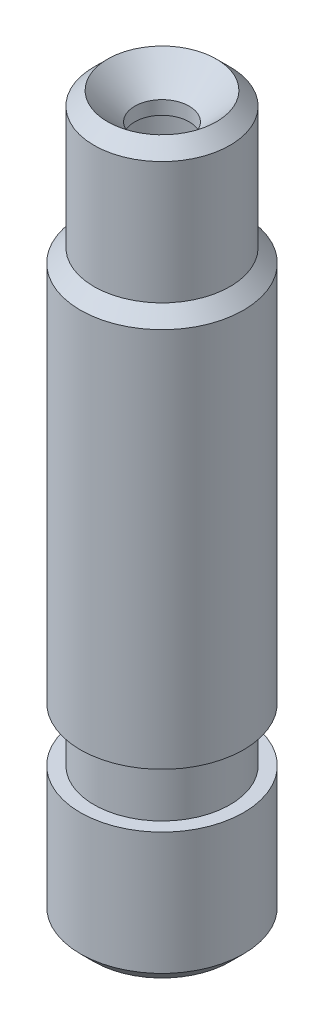
ISO-10303-21;
HEADER;
FILE_DESCRIPTION(('STEP AP214'),'2;1');
FILE_NAME('part.step','',(''),(''),'','','');
FILE_SCHEMA(('AUTOMOTIVE_DESIGN { 1 0 10303 214 1 1 1 1 }'));
ENDSEC;
DATA;
#1=APPLICATION_CONTEXT('core data for automotive mechanical design processes');
#2=APPLICATION_PROTOCOL_DEFINITION('international standard','automotive_design',2000,#1);
#3=PRODUCT_CONTEXT('',#1,'mechanical');
#4=PRODUCT('Part','Part','',(#3));
#5=PRODUCT_RELATED_PRODUCT_CATEGORY('part','',(#4));
#6=PRODUCT_DEFINITION_FORMATION('','',#4);
#7=PRODUCT_DEFINITION_CONTEXT('part definition',#1,'design');
#8=PRODUCT_DEFINITION('design','',#6,#7);
#9=PRODUCT_DEFINITION_SHAPE('','',#8);
#10=(LENGTH_UNIT() NAMED_UNIT(*) SI_UNIT(.MILLI.,.METRE.));
#11=(NAMED_UNIT(*) PLANE_ANGLE_UNIT() SI_UNIT($,.RADIAN.));
#12=(NAMED_UNIT(*) SI_UNIT($,.STERADIAN.) SOLID_ANGLE_UNIT());
#13=UNCERTAINTY_MEASURE_WITH_UNIT(LENGTH_MEASURE(1.E-05),#10,'distance_accuracy_value','');
#14=(GEOMETRIC_REPRESENTATION_CONTEXT(3) GLOBAL_UNCERTAINTY_ASSIGNED_CONTEXT((#13)) GLOBAL_UNIT_ASSIGNED_CONTEXT((#10,
#11,#12)) REPRESENTATION_CONTEXT('',''));
#15=CARTESIAN_POINT('',(0.,0.,0.));
#16=DIRECTION('',(0.,0.,1.));
#17=DIRECTION('',(1.,0.,0.));
#18=AXIS2_PLACEMENT_3D('',#15,#16,#17);
#19=CARTESIAN_POINT('',(0.,26.5,0.));
#20=DIRECTION('',(0.,-1.,0.));
#21=DIRECTION('',(0.,0.,-1.));
#22=AXIS2_PLACEMENT_3D('',#19,#20,#21);
#23=CYLINDRICAL_SURFACE('',#22,3.);
#24=CARTESIAN_POINT('',(0.,21.,0.));
#25=DIRECTION('',(0.,1.,0.));
#26=DIRECTION('',(0.,0.,1.));
#27=AXIS2_PLACEMENT_3D('',#24,#25,#26);
#28=CIRCLE('',#27,3.);
#29=CARTESIAN_POINT('',(0.,21.,3.));
#30=VERTEX_POINT('',#29);
#31=EDGE_CURVE('E38',#30,#30,#28,.F.);
#32=ORIENTED_EDGE('',*,*,#31,.T.);
#33=EDGE_LOOP('',(#32));
#34=FACE_BOUND('',#33,.T.);
#35=CARTESIAN_POINT('',(0.,7.,0.));
#36=DIRECTION('',(0.,-1.,0.));
#37=DIRECTION('',(0.,0.,-1.));
#38=AXIS2_PLACEMENT_3D('',#35,#36,#37);
#39=CIRCLE('',#38,3.);
#40=CARTESIAN_POINT('',(0.,7.,-3.));
#41=VERTEX_POINT('',#40);
#42=EDGE_CURVE('E41',#41,#41,#39,.T.);
#43=ORIENTED_EDGE('',*,*,#42,.F.);
#44=EDGE_LOOP('',(#43));
#45=FACE_BOUND('',#44,.T.);
#46=ADVANCED_FACE('F15',(#34,#45),#23,.T.);
#47=CARTESIAN_POINT('',(0.,26.5,0.));
#48=DIRECTION('',(0.,-1.,0.));
#49=DIRECTION('',(0.,0.,-1.));
#50=AXIS2_PLACEMENT_3D('',#47,#48,#49);
#51=CYLINDRICAL_SURFACE('',#50,1.);
#52=CARTESIAN_POINT('',(0.,25.5,0.));
#53=DIRECTION('',(0.,1.,0.));
#54=DIRECTION('',(0.,0.,1.));
#55=AXIS2_PLACEMENT_3D('',#52,#53,#54);
#56=CIRCLE('',#55,1.);
#57=CARTESIAN_POINT('',(0.,25.5,1.));
#58=VERTEX_POINT('',#57);
#59=EDGE_CURVE('E10',#58,#58,#56,.T.);
#60=ORIENTED_EDGE('',*,*,#59,.T.);
#61=EDGE_LOOP('',(#60));
#62=FACE_BOUND('',#61,.T.);
#63=CARTESIAN_POINT('',(0.,25.,0.));
#64=DIRECTION('',(0.,-1.,0.));
#65=DIRECTION('',(0.,0.,-1.));
#66=AXIS2_PLACEMENT_3D('',#63,#64,#65);
#67=CIRCLE('',#66,1.);
#68=CARTESIAN_POINT('',(0.,25.,-1.));
#69=VERTEX_POINT('',#68);
#70=EDGE_CURVE('E42',#69,#69,#67,.T.);
#71=ORIENTED_EDGE('',*,*,#70,.T.);
#72=EDGE_LOOP('',(#71));
#73=FACE_BOUND('',#72,.T.);
#74=ADVANCED_FACE('F88',(#62,#73),#51,.F.);
#75=CARTESIAN_POINT('',(0.,0.,0.));
#76=DIRECTION('',(0.,1.,0.));
#77=DIRECTION('',(0.,0.,1.));
#78=AXIS2_PLACEMENT_3D('',#75,#76,#77);
#79=PLANE('',#78);
#80=CARTESIAN_POINT('',(0.,0.,0.));
#81=DIRECTION('',(0.,1.,0.));
#82=DIRECTION('',(0.,0.,1.));
#83=AXIS2_PLACEMENT_3D('',#80,#81,#82);
#84=CIRCLE('',#83,2.5);
#85=CARTESIAN_POINT('',(0.,0.,2.5));
#86=VERTEX_POINT('',#85);
#87=EDGE_CURVE('E22',#86,#86,#84,.F.);
#88=ORIENTED_EDGE('',*,*,#87,.T.);
#89=EDGE_LOOP('',(#88));
#90=FACE_BOUND('',#89,.T.);
#91=CARTESIAN_POINT('',(0.,0.,0.));
#92=DIRECTION('',(0.,-1.,0.));
#93=DIRECTION('',(0.,0.,-1.));
#94=AXIS2_PLACEMENT_3D('',#91,#92,#93);
#95=CIRCLE('',#94,2.05);
#96=CARTESIAN_POINT('',(0.,0.,-2.05));
#97=VERTEX_POINT('',#96);
#98=EDGE_CURVE('E57',#97,#97,#95,.T.);
#99=ORIENTED_EDGE('',*,*,#98,.F.);
#100=EDGE_LOOP('',(#99));
#101=FACE_BOUND('',#100,.T.);
#102=ADVANCED_FACE('F95',(#90,#101),#79,.F.);
#103=CARTESIAN_POINT('',(0.,0.500000000000007,0.));
#104=DIRECTION('',(0.,1.,0.));
#105=DIRECTION('',(0.,0.,1.));
#106=AXIS2_PLACEMENT_3D('',#103,#104,#105);
#107=CIRCLE('',#106,3.);
#108=CARTESIAN_POINT('',(0.,0.500000000000007,3.));
#109=VERTEX_POINT('',#108);
#110=EDGE_CURVE('E26',#109,#109,#107,.T.);
#111=ORIENTED_EDGE('',*,*,#110,.T.);
#112=EDGE_LOOP('',(#111));
#113=FACE_BOUND('',#112,.T.);
#114=CARTESIAN_POINT('',(0.,5.,0.));
#115=DIRECTION('',(0.,-1.,0.));
#116=DIRECTION('',(0.,0.,-1.));
#117=AXIS2_PLACEMENT_3D('',#114,#115,#116);
#118=CIRCLE('',#117,3.);
#119=CARTESIAN_POINT('',(0.,5.,-3.));
#120=VERTEX_POINT('',#119);
#121=EDGE_CURVE('E49',#120,#120,#118,.T.);
#122=ORIENTED_EDGE('',*,*,#121,.T.);
#123=EDGE_LOOP('',(#122));
#124=FACE_BOUND('',#123,.T.);
#125=ADVANCED_FACE('F90',(#113,#124),#23,.T.);
#126=CARTESIAN_POINT('',(0.,7.,0.));
#127=DIRECTION('',(0.,-1.,0.));
#128=DIRECTION('',(0.,0.,-1.));
#129=AXIS2_PLACEMENT_3D('',#126,#127,#128);
#130=PLANE('',#129);
#131=CARTESIAN_POINT('',(0.,7.,0.));
#132=DIRECTION('',(0.,-1.,0.));
#133=DIRECTION('',(0.,0.,-1.));
#134=AXIS2_PLACEMENT_3D('',#131,#132,#133);
#135=CIRCLE('',#134,2.5);
#136=CARTESIAN_POINT('',(0.,7.,-2.5));
#137=VERTEX_POINT('',#136);
#138=EDGE_CURVE('E52',#137,#137,#135,.T.);
#139=ORIENTED_EDGE('',*,*,#138,.F.);
#140=EDGE_LOOP('',(#139));
#141=FACE_BOUND('',#140,.T.);
#142=ORIENTED_EDGE('',*,*,#42,.T.);
#143=EDGE_LOOP('',(#142));
#144=FACE_BOUND('',#143,.T.);
#145=ADVANCED_FACE('F100',(#141,#144),#130,.T.);
#146=CARTESIAN_POINT('',(0.,5.,0.));
#147=DIRECTION('',(0.,-1.,0.));
#148=DIRECTION('',(0.,0.,-1.));
#149=AXIS2_PLACEMENT_3D('',#146,#147,#148);
#150=PLANE('',#149);
#151=CARTESIAN_POINT('',(0.,5.,0.));
#152=DIRECTION('',(0.,-1.,0.));
#153=DIRECTION('',(0.,0.,-1.));
#154=AXIS2_PLACEMENT_3D('',#151,#152,#153);
#155=CIRCLE('',#154,2.5);
#156=CARTESIAN_POINT('',(0.,5.,-2.5));
#157=VERTEX_POINT('',#156);
#158=EDGE_CURVE('E45',#157,#157,#155,.T.);
#159=ORIENTED_EDGE('',*,*,#158,.T.);
#160=EDGE_LOOP('',(#159));
#161=FACE_BOUND('',#160,.T.);
#162=ORIENTED_EDGE('',*,*,#121,.F.);
#163=EDGE_LOOP('',(#162));
#164=FACE_BOUND('',#163,.T.);
#165=ADVANCED_FACE('F107',(#161,#164),#150,.F.);
#166=CARTESIAN_POINT('',(0.,7.,0.));
#167=DIRECTION('',(0.,-1.,0.));
#168=DIRECTION('',(0.,0.,-1.));
#169=AXIS2_PLACEMENT_3D('',#166,#167,#168);
#170=CYLINDRICAL_SURFACE('',#169,2.5);
#171=ORIENTED_EDGE('',*,*,#138,.T.);
#172=EDGE_LOOP('',(#171));
#173=FACE_BOUND('',#172,.T.);
#174=ORIENTED_EDGE('',*,*,#158,.F.);
#175=EDGE_LOOP('',(#174));
#176=FACE_BOUND('',#175,.T.);
#177=ADVANCED_FACE('F115',(#173,#176),#170,.T.);
#178=CARTESIAN_POINT('',(0.,25.,0.));
#179=DIRECTION('',(0.,-1.,0.));
#180=DIRECTION('',(0.,0.,-1.));
#181=AXIS2_PLACEMENT_3D('',#178,#179,#180);
#182=CYLINDRICAL_SURFACE('',#181,2.05);
#183=CARTESIAN_POINT('',(0.,25.,0.));
#184=DIRECTION('',(0.,-1.,0.));
#185=DIRECTION('',(0.,0.,-1.));
#186=AXIS2_PLACEMENT_3D('',#183,#184,#185);
#187=CIRCLE('',#186,2.05);
#188=CARTESIAN_POINT('',(0.,25.,-2.05));
#189=VERTEX_POINT('',#188);
#190=EDGE_CURVE('E46',#189,#189,#187,.T.);
#191=ORIENTED_EDGE('',*,*,#190,.F.);
#192=EDGE_LOOP('',(#191));
#193=FACE_BOUND('',#192,.T.);
#194=ORIENTED_EDGE('',*,*,#98,.T.);
#195=EDGE_LOOP('',(#194));
#196=FACE_BOUND('',#195,.T.);
#197=ADVANCED_FACE('F122',(#193,#196),#182,.F.);
#198=CARTESIAN_POINT('',(0.,25.,0.));
#199=DIRECTION('',(0.,-1.,0.));
#200=DIRECTION('',(0.,0.,-1.));
#201=AXIS2_PLACEMENT_3D('',#198,#199,#200);
#202=PLANE('',#201);
#203=ORIENTED_EDGE('',*,*,#70,.F.);
#204=EDGE_LOOP('',(#203));
#205=FACE_BOUND('',#204,.T.);
#206=ORIENTED_EDGE('',*,*,#190,.T.);
#207=EDGE_LOOP('',(#206));
#208=FACE_BOUND('',#207,.T.);
#209=ADVANCED_FACE('F82',(#205,#208),#202,.T.);
#210=CARTESIAN_POINT('',(0.,21.5,0.));
#211=DIRECTION('',(0.,1.,0.));
#212=DIRECTION('',(0.,0.,1.));
#213=AXIS2_PLACEMENT_3D('',#210,#211,#212);
#214=CYLINDRICAL_SURFACE('',#213,2.5);
#215=CARTESIAN_POINT('',(0.,26.,0.));
#216=DIRECTION('',(0.,1.,0.));
#217=DIRECTION('',(0.,0.,1.));
#218=AXIS2_PLACEMENT_3D('',#215,#216,#217);
#219=CIRCLE('',#218,2.5);
#220=CARTESIAN_POINT('',(0.,26.,2.5));
#221=VERTEX_POINT('',#220);
#222=EDGE_CURVE('E30',#221,#221,#219,.F.);
#223=ORIENTED_EDGE('',*,*,#222,.T.);
#224=EDGE_LOOP('',(#223));
#225=FACE_BOUND('',#224,.T.);
#226=CARTESIAN_POINT('',(0.,21.5,0.));
#227=DIRECTION('',(0.,1.,0.));
#228=DIRECTION('',(0.,0.,1.));
#229=AXIS2_PLACEMENT_3D('',#226,#227,#228);
#230=CIRCLE('',#229,2.5);
#231=CARTESIAN_POINT('',(0.,21.5,2.5));
#232=VERTEX_POINT('',#231);
#233=EDGE_CURVE('E60',#232,#232,#230,.T.);
#234=ORIENTED_EDGE('',*,*,#233,.T.);
#235=EDGE_LOOP('',(#234));
#236=FACE_BOUND('',#235,.T.);
#237=ADVANCED_FACE('F66',(#225,#236),#214,.T.);
#238=CARTESIAN_POINT('',(0.,21.5,0.));
#239=DIRECTION('',(0.,-1.,0.));
#240=DIRECTION('',(0.,0.,-1.));
#241=AXIS2_PLACEMENT_3D('',#238,#239,#240);
#242=CONICAL_SURFACE('',#241,2.5,0.785398163397446);
#243=ORIENTED_EDGE('',*,*,#31,.F.);
#244=EDGE_LOOP('',(#243));
#245=FACE_BOUND('',#244,.T.);
#246=ORIENTED_EDGE('',*,*,#233,.F.);
#247=EDGE_LOOP('',(#246));
#248=FACE_BOUND('',#247,.T.);
#249=ADVANCED_FACE('F68',(#245,#248),#242,.T.);
#250=CARTESIAN_POINT('',(0.,26.5,0.));
#251=DIRECTION('',(0.,-1.,0.));
#252=DIRECTION('',(0.,0.,-1.));
#253=AXIS2_PLACEMENT_3D('',#250,#251,#252);
#254=CONICAL_SURFACE('',#253,2.,0.78539816339745);
#255=ORIENTED_EDGE('',*,*,#222,.F.);
#256=EDGE_LOOP('',(#255));
#257=FACE_BOUND('',#256,.T.);
#258=CARTESIAN_POINT('',(0.,26.5,0.));
#259=DIRECTION('',(0.,1.,0.));
#260=DIRECTION('',(0.,0.,1.));
#261=AXIS2_PLACEMENT_3D('',#258,#259,#260);
#262=CIRCLE('',#261,2.);
#263=CARTESIAN_POINT('',(0.,26.5,2.));
#264=VERTEX_POINT('',#263);
#265=EDGE_CURVE('E35',#264,#264,#262,.T.);
#266=ORIENTED_EDGE('',*,*,#265,.F.);
#267=EDGE_LOOP('',(#266));
#268=FACE_BOUND('',#267,.T.);
#269=ADVANCED_FACE('F70',(#257,#268),#254,.T.);
#270=CARTESIAN_POINT('',(0.,0.500000000000007,0.));
#271=DIRECTION('',(0.,1.,0.));
#272=DIRECTION('',(0.,0.,1.));
#273=AXIS2_PLACEMENT_3D('',#270,#271,#272);
#274=CONICAL_SURFACE('',#273,3.,0.785398163397452);
#275=ORIENTED_EDGE('',*,*,#87,.F.);
#276=EDGE_LOOP('',(#275));
#277=FACE_BOUND('',#276,.T.);
#278=ORIENTED_EDGE('',*,*,#110,.F.);
#279=EDGE_LOOP('',(#278));
#280=FACE_BOUND('',#279,.T.);
#281=ADVANCED_FACE('F79',(#277,#280),#274,.T.);
#282=CARTESIAN_POINT('',(0.,25.5,0.));
#283=DIRECTION('',(0.,1.,0.));
#284=DIRECTION('',(0.,0.,1.));
#285=AXIS2_PLACEMENT_3D('',#282,#283,#284);
#286=CONICAL_SURFACE('',#285,1.,0.78539816339745);
#287=ORIENTED_EDGE('',*,*,#265,.T.);
#288=EDGE_LOOP('',(#287));
#289=FACE_BOUND('',#288,.T.);
#290=ORIENTED_EDGE('',*,*,#59,.F.);
#291=EDGE_LOOP('',(#290));
#292=FACE_BOUND('',#291,.T.);
#293=ADVANCED_FACE('F17',(#289,#292),#286,.F.);
#294=CLOSED_SHELL('',(#46,#74,#102,#125,#145,#165,#177,#197,#209,#237,#249,#269,#281,#293));
#295=MANIFOLD_SOLID_BREP('B1',#294);
#296=ADVANCED_BREP_SHAPE_REPRESENTATION('',(#18,#295),#14);
#297=SHAPE_DEFINITION_REPRESENTATION(#9,#296);
ENDSEC;
END-ISO-10303-21;
